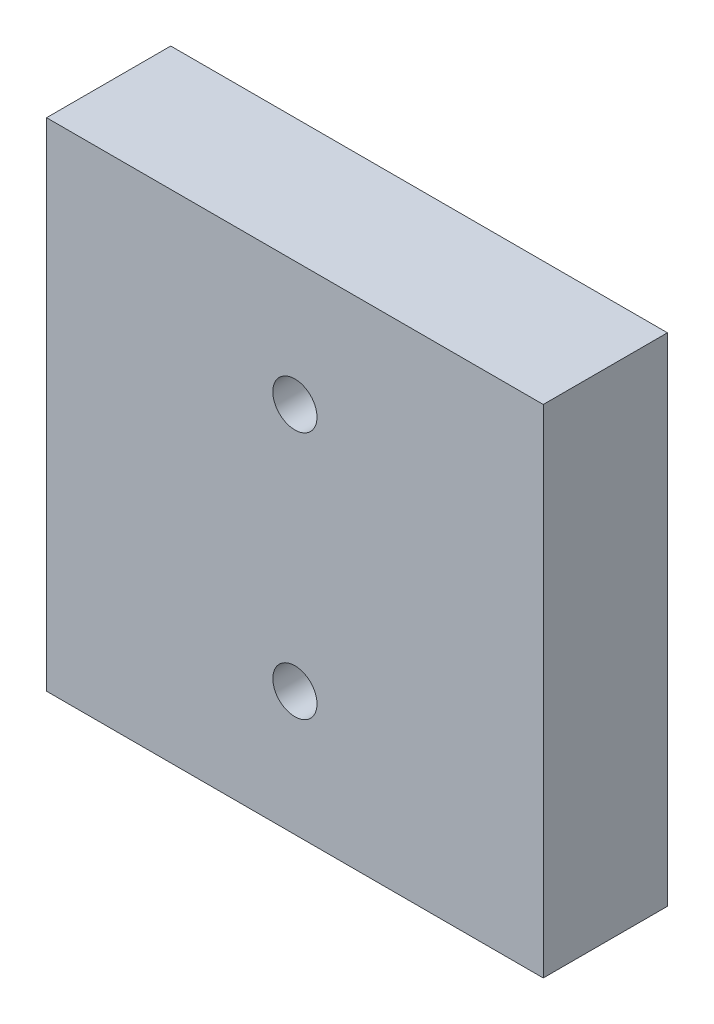
ISO-10303-21;
HEADER;
FILE_DESCRIPTION(('STEP AP214'),'2;1');
FILE_NAME('part.step','',(''),(''),'','','');
FILE_SCHEMA(('AUTOMOTIVE_DESIGN { 1 0 10303 214 1 1 1 1 }'));
ENDSEC;
DATA;
#1=APPLICATION_CONTEXT('core data for automotive mechanical design processes');
#2=APPLICATION_PROTOCOL_DEFINITION('international standard','automotive_design',2000,#1);
#3=PRODUCT_CONTEXT('',#1,'mechanical');
#4=PRODUCT('Part','Part','',(#3));
#5=PRODUCT_RELATED_PRODUCT_CATEGORY('part','',(#4));
#6=PRODUCT_DEFINITION_FORMATION('','',#4);
#7=PRODUCT_DEFINITION_CONTEXT('part definition',#1,'design');
#8=PRODUCT_DEFINITION('design','',#6,#7);
#9=PRODUCT_DEFINITION_SHAPE('','',#8);
#10=(LENGTH_UNIT() NAMED_UNIT(*) SI_UNIT(.MILLI.,.METRE.));
#11=(NAMED_UNIT(*) PLANE_ANGLE_UNIT() SI_UNIT($,.RADIAN.));
#12=(NAMED_UNIT(*) SI_UNIT($,.STERADIAN.) SOLID_ANGLE_UNIT());
#13=UNCERTAINTY_MEASURE_WITH_UNIT(LENGTH_MEASURE(1.E-05),#10,'distance_accuracy_value','');
#14=(GEOMETRIC_REPRESENTATION_CONTEXT(3) GLOBAL_UNCERTAINTY_ASSIGNED_CONTEXT((#13)) GLOBAL_UNIT_ASSIGNED_CONTEXT((#10,
#11,#12)) REPRESENTATION_CONTEXT('',''));
#15=CARTESIAN_POINT('',(0.,0.,0.));
#16=DIRECTION('',(0.,0.,1.));
#17=DIRECTION('',(1.,0.,0.));
#18=AXIS2_PLACEMENT_3D('',#15,#16,#17);
#19=CARTESIAN_POINT('',(0.,0.,6.35));
#20=DIRECTION('',(1.,0.,0.));
#21=DIRECTION('',(0.,0.,-1.));
#22=AXIS2_PLACEMENT_3D('',#19,#20,#21);
#23=PLANE('',#22);
#24=DIRECTION('',(0.,-1.,0.));
#25=VECTOR('',#24,1.);
#26=CARTESIAN_POINT('',(0.,0.,0.));
#27=LINE('',#26,#25);
#28=CARTESIAN_POINT('',(0.,25.4,0.));
#29=VERTEX_POINT('',#28);
#30=CARTESIAN_POINT('',(0.,0.,0.));
#31=VERTEX_POINT('',#30);
#32=EDGE_CURVE('E96',#29,#31,#27,.T.);
#33=ORIENTED_EDGE('',*,*,#32,.T.);
#34=DIRECTION('',(0.,0.,-1.));
#35=VECTOR('',#34,1.);
#36=CARTESIAN_POINT('',(0.,0.,6.35));
#37=LINE('',#36,#35);
#38=CARTESIAN_POINT('',(0.,0.,6.35));
#39=VERTEX_POINT('',#38);
#40=EDGE_CURVE('E11',#39,#31,#37,.T.);
#41=ORIENTED_EDGE('',*,*,#40,.F.);
#42=DIRECTION('',(0.,-1.,0.));
#43=VECTOR('',#42,1.);
#44=CARTESIAN_POINT('',(0.,0.,6.35));
#45=LINE('',#44,#43);
#46=CARTESIAN_POINT('',(0.,25.4,6.35));
#47=VERTEX_POINT('',#46);
#48=EDGE_CURVE('E84',#47,#39,#45,.T.);
#49=ORIENTED_EDGE('',*,*,#48,.F.);
#50=DIRECTION('',(0.,0.,-1.));
#51=VECTOR('',#50,1.);
#52=CARTESIAN_POINT('',(0.,25.4,6.35));
#53=LINE('',#52,#51);
#54=EDGE_CURVE('E92',#47,#29,#53,.T.);
#55=ORIENTED_EDGE('',*,*,#54,.T.);
#56=EDGE_LOOP('',(#33,#41,#49,#55));
#57=FACE_BOUND('',#56,.T.);
#58=ADVANCED_FACE('F33',(#57),#23,.F.);
#59=CARTESIAN_POINT('',(0.,0.,6.35));
#60=DIRECTION('',(0.,1.,0.));
#61=DIRECTION('',(0.,0.,1.));
#62=AXIS2_PLACEMENT_3D('',#59,#60,#61);
#63=PLANE('',#62);
#64=DIRECTION('',(1.,0.,0.));
#65=VECTOR('',#64,1.);
#66=CARTESIAN_POINT('',(0.,0.,0.));
#67=LINE('',#66,#65);
#68=CARTESIAN_POINT('',(25.4,0.,0.));
#69=VERTEX_POINT('',#68);
#70=EDGE_CURVE('E88',#31,#69,#67,.T.);
#71=ORIENTED_EDGE('',*,*,#70,.T.);
#72=DIRECTION('',(0.,0.,-1.));
#73=VECTOR('',#72,1.);
#74=CARTESIAN_POINT('',(25.4,0.,6.35));
#75=LINE('',#74,#73);
#76=CARTESIAN_POINT('',(25.4,0.,6.35));
#77=VERTEX_POINT('',#76);
#78=EDGE_CURVE('E41',#77,#69,#75,.T.);
#79=ORIENTED_EDGE('',*,*,#78,.F.);
#80=DIRECTION('',(1.,0.,0.));
#81=VECTOR('',#80,1.);
#82=CARTESIAN_POINT('',(0.,0.,6.35));
#83=LINE('',#82,#81);
#84=EDGE_CURVE('E79',#39,#77,#83,.T.);
#85=ORIENTED_EDGE('',*,*,#84,.F.);
#86=ORIENTED_EDGE('',*,*,#40,.T.);
#87=EDGE_LOOP('',(#71,#79,#85,#86));
#88=FACE_BOUND('',#87,.T.);
#89=ADVANCED_FACE('F87',(#88),#63,.F.);
#90=CARTESIAN_POINT('',(25.4,0.,6.35));
#91=DIRECTION('',(-1.,0.,0.));
#92=DIRECTION('',(0.,0.,1.));
#93=AXIS2_PLACEMENT_3D('',#90,#91,#92);
#94=PLANE('',#93);
#95=DIRECTION('',(0.,1.,0.));
#96=VECTOR('',#95,1.);
#97=CARTESIAN_POINT('',(25.4,0.,0.));
#98=LINE('',#97,#96);
#99=CARTESIAN_POINT('',(25.4,25.4,0.));
#100=VERTEX_POINT('',#99);
#101=EDGE_CURVE('E66',#69,#100,#98,.T.);
#102=ORIENTED_EDGE('',*,*,#101,.T.);
#103=DIRECTION('',(0.,0.,-1.));
#104=VECTOR('',#103,1.);
#105=CARTESIAN_POINT('',(25.4,25.4,6.35));
#106=LINE('',#105,#104);
#107=CARTESIAN_POINT('',(25.4,25.4,6.35));
#108=VERTEX_POINT('',#107);
#109=EDGE_CURVE('E89',#108,#100,#106,.T.);
#110=ORIENTED_EDGE('',*,*,#109,.F.);
#111=DIRECTION('',(0.,1.,0.));
#112=VECTOR('',#111,1.);
#113=CARTESIAN_POINT('',(25.4,0.,6.35));
#114=LINE('',#113,#112);
#115=EDGE_CURVE('E82',#77,#108,#114,.T.);
#116=ORIENTED_EDGE('',*,*,#115,.F.);
#117=ORIENTED_EDGE('',*,*,#78,.T.);
#118=EDGE_LOOP('',(#102,#110,#116,#117));
#119=FACE_BOUND('',#118,.T.);
#120=ADVANCED_FACE('F90',(#119),#94,.F.);
#121=CARTESIAN_POINT('',(0.,25.4,6.35));
#122=DIRECTION('',(0.,-1.,0.));
#123=DIRECTION('',(0.,0.,-1.));
#124=AXIS2_PLACEMENT_3D('',#121,#122,#123);
#125=PLANE('',#124);
#126=DIRECTION('',(-1.,0.,0.));
#127=VECTOR('',#126,1.);
#128=CARTESIAN_POINT('',(0.,25.4,0.));
#129=LINE('',#128,#127);
#130=EDGE_CURVE('E72',#100,#29,#129,.T.);
#131=ORIENTED_EDGE('',*,*,#130,.T.);
#132=ORIENTED_EDGE('',*,*,#54,.F.);
#133=DIRECTION('',(-1.,0.,0.));
#134=VECTOR('',#133,1.);
#135=CARTESIAN_POINT('',(0.,25.4,6.35));
#136=LINE('',#135,#134);
#137=EDGE_CURVE('E49',#108,#47,#136,.T.);
#138=ORIENTED_EDGE('',*,*,#137,.F.);
#139=ORIENTED_EDGE('',*,*,#109,.T.);
#140=EDGE_LOOP('',(#131,#132,#138,#139));
#141=FACE_BOUND('',#140,.T.);
#142=ADVANCED_FACE('F104',(#141),#125,.F.);
#143=CARTESIAN_POINT('',(0.,0.,6.35));
#144=DIRECTION('',(0.,0.,-1.));
#145=DIRECTION('',(-1.,0.,0.));
#146=AXIS2_PLACEMENT_3D('',#143,#144,#145);
#147=PLANE('',#146);
#148=CARTESIAN_POINT('',(12.7,6.35,6.35));
#149=DIRECTION('',(0.,0.,-1.));
#150=DIRECTION('',(-1.,0.,0.));
#151=AXIS2_PLACEMENT_3D('',#148,#149,#150);
#152=CIRCLE('',#151,1.13029999999999);
#153=CARTESIAN_POINT('',(11.5697,6.35,6.35));
#154=VERTEX_POINT('',#153);
#155=EDGE_CURVE('E115',#154,#154,#152,.T.);
#156=ORIENTED_EDGE('',*,*,#155,.T.);
#157=EDGE_LOOP('',(#156));
#158=FACE_BOUND('',#157,.T.);
#159=CARTESIAN_POINT('',(12.7,19.05,6.35));
#160=DIRECTION('',(0.,0.,-1.));
#161=DIRECTION('',(-1.,0.,0.));
#162=AXIS2_PLACEMENT_3D('',#159,#160,#161);
#163=CIRCLE('',#162,1.13029999999999);
#164=CARTESIAN_POINT('',(11.5697,19.05,6.35));
#165=VERTEX_POINT('',#164);
#166=EDGE_CURVE('E99',#165,#165,#163,.T.);
#167=ORIENTED_EDGE('',*,*,#166,.T.);
#168=EDGE_LOOP('',(#167));
#169=FACE_BOUND('',#168,.T.);
#170=ORIENTED_EDGE('',*,*,#48,.T.);
#171=ORIENTED_EDGE('',*,*,#84,.T.);
#172=ORIENTED_EDGE('',*,*,#115,.T.);
#173=ORIENTED_EDGE('',*,*,#137,.T.);
#174=EDGE_LOOP('',(#170,#171,#172,#173));
#175=FACE_BOUND('',#174,.T.);
#176=ADVANCED_FACE('F80',(#158,#169,#175),#147,.F.);
#177=CARTESIAN_POINT('',(0.,0.,0.));
#178=DIRECTION('',(0.,0.,-1.));
#179=DIRECTION('',(-1.,0.,0.));
#180=AXIS2_PLACEMENT_3D('',#177,#178,#179);
#181=PLANE('',#180);
#182=CARTESIAN_POINT('',(12.7,6.35,0.));
#183=DIRECTION('',(0.,0.,-1.));
#184=DIRECTION('',(-1.,0.,0.));
#185=AXIS2_PLACEMENT_3D('',#182,#183,#184);
#186=CIRCLE('',#185,1.13029999999999);
#187=CARTESIAN_POINT('',(11.5697,6.35,0.));
#188=VERTEX_POINT('',#187);
#189=EDGE_CURVE('E118',#188,#188,#186,.T.);
#190=ORIENTED_EDGE('',*,*,#189,.F.);
#191=EDGE_LOOP('',(#190));
#192=FACE_BOUND('',#191,.T.);
#193=CARTESIAN_POINT('',(12.7,19.05,0.));
#194=DIRECTION('',(0.,0.,-1.));
#195=DIRECTION('',(-1.,0.,0.));
#196=AXIS2_PLACEMENT_3D('',#193,#194,#195);
#197=CIRCLE('',#196,1.13029999999999);
#198=CARTESIAN_POINT('',(11.5697,19.05,0.));
#199=VERTEX_POINT('',#198);
#200=EDGE_CURVE('E112',#199,#199,#197,.T.);
#201=ORIENTED_EDGE('',*,*,#200,.F.);
#202=EDGE_LOOP('',(#201));
#203=FACE_BOUND('',#202,.T.);
#204=ORIENTED_EDGE('',*,*,#32,.F.);
#205=ORIENTED_EDGE('',*,*,#130,.F.);
#206=ORIENTED_EDGE('',*,*,#101,.F.);
#207=ORIENTED_EDGE('',*,*,#70,.F.);
#208=EDGE_LOOP('',(#204,#205,#206,#207));
#209=FACE_BOUND('',#208,.T.);
#210=ADVANCED_FACE('F107',(#192,#203,#209),#181,.T.);
#211=CARTESIAN_POINT('',(12.7,19.05,0.));
#212=DIRECTION('',(0.,0.,-1.));
#213=DIRECTION('',(-1.,0.,0.));
#214=AXIS2_PLACEMENT_3D('',#211,#212,#213);
#215=CYLINDRICAL_SURFACE('',#214,1.13029999999999);
#216=ORIENTED_EDGE('',*,*,#166,.F.);
#217=EDGE_LOOP('',(#216));
#218=FACE_BOUND('',#217,.T.);
#219=ORIENTED_EDGE('',*,*,#200,.T.);
#220=EDGE_LOOP('',(#219));
#221=FACE_BOUND('',#220,.T.);
#222=ADVANCED_FACE('F126',(#218,#221),#215,.F.);
#223=CARTESIAN_POINT('',(12.7,6.35,0.));
#224=DIRECTION('',(0.,0.,-1.));
#225=DIRECTION('',(-1.,0.,0.));
#226=AXIS2_PLACEMENT_3D('',#223,#224,#225);
#227=CYLINDRICAL_SURFACE('',#226,1.13029999999999);
#228=ORIENTED_EDGE('',*,*,#155,.F.);
#229=EDGE_LOOP('',(#228));
#230=FACE_BOUND('',#229,.T.);
#231=ORIENTED_EDGE('',*,*,#189,.T.);
#232=EDGE_LOOP('',(#231));
#233=FACE_BOUND('',#232,.T.);
#234=ADVANCED_FACE('F122',(#230,#233),#227,.F.);
#235=CLOSED_SHELL('',(#58,#89,#120,#142,#176,#210,#222,#234));
#236=MANIFOLD_SOLID_BREP('B2',#235);
#237=ADVANCED_BREP_SHAPE_REPRESENTATION('',(#18,#236),#14);
#238=SHAPE_DEFINITION_REPRESENTATION(#9,#237);
ENDSEC;
END-ISO-10303-21;
